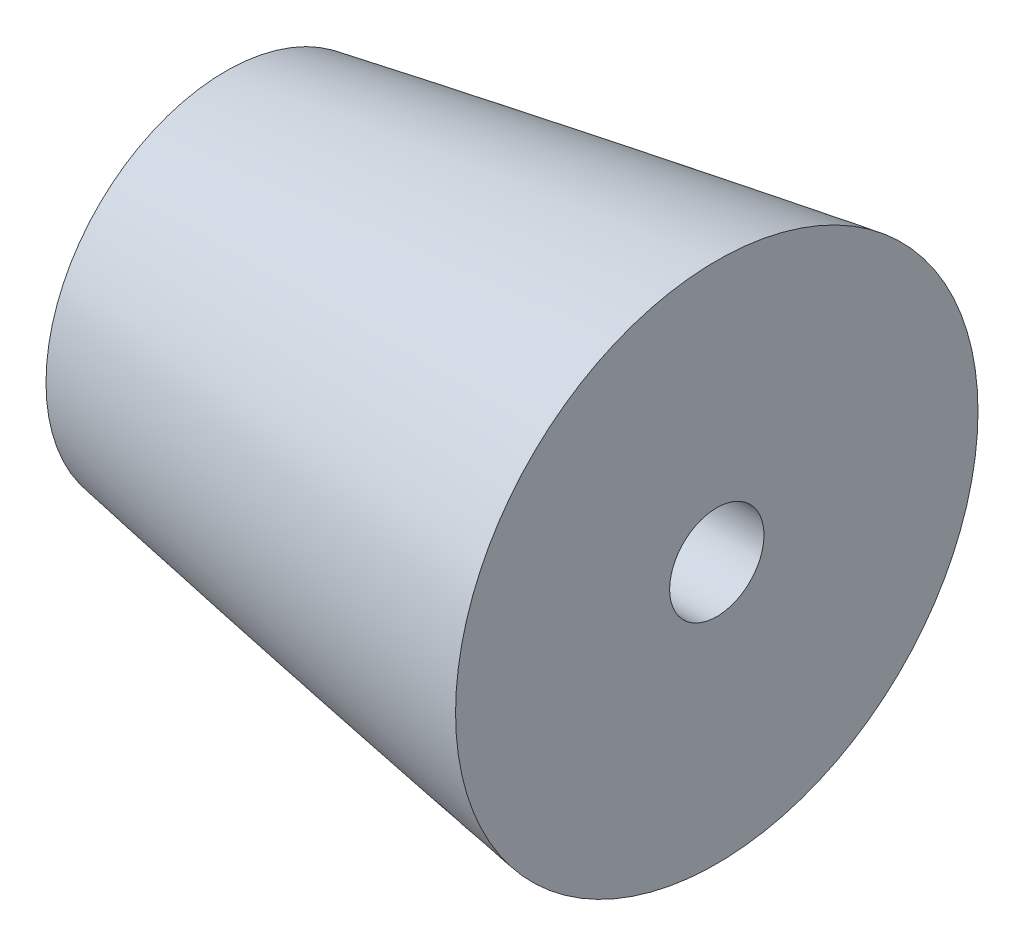
ISO-10303-21;
HEADER;
FILE_DESCRIPTION(('STEP AP214'),'2;1');
FILE_NAME('part.step','',(''),(''),'','','');
FILE_SCHEMA(('AUTOMOTIVE_DESIGN { 1 0 10303 214 1 1 1 1 }'));
ENDSEC;
DATA;
#1=APPLICATION_CONTEXT('core data for automotive mechanical design processes');
#2=APPLICATION_PROTOCOL_DEFINITION('international standard','automotive_design',2000,#1);
#3=PRODUCT_CONTEXT('',#1,'mechanical');
#4=PRODUCT('Part','Part','',(#3));
#5=PRODUCT_RELATED_PRODUCT_CATEGORY('part','',(#4));
#6=PRODUCT_DEFINITION_FORMATION('','',#4);
#7=PRODUCT_DEFINITION_CONTEXT('part definition',#1,'design');
#8=PRODUCT_DEFINITION('design','',#6,#7);
#9=PRODUCT_DEFINITION_SHAPE('','',#8);
#10=(LENGTH_UNIT() NAMED_UNIT(*) SI_UNIT(.MILLI.,.METRE.));
#11=(NAMED_UNIT(*) PLANE_ANGLE_UNIT() SI_UNIT($,.RADIAN.));
#12=(NAMED_UNIT(*) SI_UNIT($,.STERADIAN.) SOLID_ANGLE_UNIT());
#13=UNCERTAINTY_MEASURE_WITH_UNIT(LENGTH_MEASURE(1.E-05),#10,'distance_accuracy_value','');
#14=(GEOMETRIC_REPRESENTATION_CONTEXT(3) GLOBAL_UNCERTAINTY_ASSIGNED_CONTEXT((#13)) GLOBAL_UNIT_ASSIGNED_CONTEXT((#10,
#11,#12)) REPRESENTATION_CONTEXT('',''));
#15=CARTESIAN_POINT('',(0.,0.,0.));
#16=DIRECTION('',(0.,0.,1.));
#17=DIRECTION('',(1.,0.,0.));
#18=AXIS2_PLACEMENT_3D('',#15,#16,#17);
#19=CARTESIAN_POINT('',(95.7417361272295,17.3307506294971,0.));
#20=CARTESIAN_POINT('',(95.7026899948998,17.3246294006313,0.));
#21=CARTESIAN_POINT('',(95.6419233132433,17.315100540442,0.));
#22=CARTESIAN_POINT('',(95.3657275831846,17.2717719736624,0.));
#23=CARTESIAN_POINT('',(94.844966023065,17.1899461968987,0.));
#24=CARTESIAN_POINT('',(93.8770321432975,17.0375215251251,0.));
#25=CARTESIAN_POINT('',(92.7200919169159,16.8549107271648,0.));
#26=CARTESIAN_POINT('',(91.6938895777855,16.6922918799878,0.));
#27=CARTESIAN_POINT('',(90.7933738588896,16.5488661369637,0.));
#28=CARTESIAN_POINT('',(89.8430486763246,16.3971104254738,0.));
#29=CARTESIAN_POINT('',(88.8036622337914,16.2308690178494,0.));
#30=CARTESIAN_POINT('',(87.4335184384484,16.0109741956014,0.));
#31=CARTESIAN_POINT('',(85.8644555807975,15.7572764929284,0.));
#32=CARTESIAN_POINT('',(83.8214372349844,15.4255271724039,0.));
#33=CARTESIAN_POINT('',(81.8732068608084,15.1063877327224,0.));
#34=CARTESIAN_POINT('',(79.210210586862,14.6675124241253,0.));
#35=CARTESIAN_POINT('',(75.9256879766702,14.1199696501742,0.));
#36=CARTESIAN_POINT('',(72.611401479552,13.5590641195812,0.));
#37=CARTESIAN_POINT('',(70.3255414876523,13.1676842475676,0.));
#38=CARTESIAN_POINT('',(68.9786704427119,12.9354844364146,0.));
#39=CARTESIAN_POINT('',(68.0318680374417,12.7718040839555,0.));
#40=CARTESIAN_POINT('',(67.1552566093692,12.6193523462813,0.));
#41=CARTESIAN_POINT('',(66.5181415679137,12.5083477131257,0.));
#42=CARTESIAN_POINT('',(66.0618214211688,12.42870420297,0.));
#43=CARTESIAN_POINT('',(65.5510248778129,12.3392667115391,0.));
#44=CARTESIAN_POINT('',(64.9850290022117,12.2399064340898,0.));
#45=CARTESIAN_POINT('',(64.4640342660645,12.148295144802,0.));
#46=CARTESIAN_POINT('',(64.1955928803577,12.1010090199987,0.));
#47=CARTESIAN_POINT('',(64.0515193016492,12.0755961078034,0.));
#48=B_SPLINE_CURVE_WITH_KNOTS('',3,(#19,#20,#21,#22,#23,#24,#25,#26,#27,#28,#29,#30,#31,#32,#33,
#34,#35,#36,#37,#38,#39,#40,#41,#42,#43,#44,#45,#46,#47),.UNSPECIFIED.,.F.,.F.,(4,1,1,1,1,1,1,1,
1,1,1,1,1,1,1,1,1,1,1,1,1,1,1,1,1,1,4),(0.0827278377681683,0.086280733408362,0.0886493305018243,
0.108790394571926,0.134852951375684,0.160915508179442,0.186978064983199,0.213040621786957,
0.239103178590715,0.265165735394473,0.29122829219823,0.343353405805746,0.395478519413262,
0.447603633020777,0.499728746628293,0.603978973843324,0.708229201058355,0.76035431466587,
0.786416871469628,0.812479428273386,0.838541985077144,0.851573263479022,0.864604541880901,
0.87763582028278,0.890667098684659,0.903698377086538,0.916729655488417),.UNSPECIFIED.);
#49=CARTESIAN_POINT('',(70.2313270881002,0.528110105895485,0.));
#50=DIRECTION('',(-1.,0.,0.));
#51=AXIS1_PLACEMENT('',#49,#50);
#52=SURFACE_OF_REVOLUTION('',#48,#51);
#53=CARTESIAN_POINT('',(64.0515193016492,0.528110105895485,0.));
#54=DIRECTION('',(-1.,0.,0.));
#55=DIRECTION('',(0.,0.,1.));
#56=AXIS2_PLACEMENT_3D('',#53,#54,#55);
#57=CIRCLE('',#56,11.5474860019079);
#58=CARTESIAN_POINT('',(64.0515193016492,0.528110105895485,11.5474860019079));
#59=VERTEX_POINT('',#58);
#60=EDGE_CURVE('E10',#59,#59,#57,.T.);
#61=ORIENTED_EDGE('',*,*,#60,.F.);
#62=EDGE_LOOP('',(#61));
#63=FACE_BOUND('',#62,.T.);
#64=CARTESIAN_POINT('',(95.5916777215706,0.528110105895485,0.));
#65=DIRECTION('',(-1.,0.,0.));
#66=DIRECTION('',(0.,0.,1.));
#67=AXIS2_PLACEMENT_3D('',#64,#65,#66);
#68=CIRCLE('',#67,16.7791079279302);
#69=CARTESIAN_POINT('',(95.5916777215706,0.528110105895485,16.7791079279302));
#70=VERTEX_POINT('',#69);
#71=EDGE_CURVE('E71',#70,#70,#68,.T.);
#72=ORIENTED_EDGE('',*,*,#71,.T.);
#73=EDGE_LOOP('',(#72));
#74=FACE_BOUND('',#73,.T.);
#75=ADVANCED_FACE('F43',(#63,#74),#52,.T.);
#76=CARTESIAN_POINT('',(64.0515193016492,8.78311010589542,0.));
#77=DIRECTION('',(1.,0.,0.));
#78=DIRECTION('',(0.,0.,-1.));
#79=AXIS2_PLACEMENT_3D('',#76,#77,#78);
#80=PLANE('',#79);
#81=CARTESIAN_POINT('',(64.0515193016492,0.528110105895485,0.));
#82=DIRECTION('',(-1.,0.,0.));
#83=DIRECTION('',(0.,0.,1.));
#84=AXIS2_PLACEMENT_3D('',#81,#82,#83);
#85=CIRCLE('',#84,8.25499999999993);
#86=CARTESIAN_POINT('',(64.0515193016492,0.528110105895485,8.25499999999993));
#87=VERTEX_POINT('',#86);
#88=EDGE_CURVE('E51',#87,#87,#85,.T.);
#89=ORIENTED_EDGE('',*,*,#88,.F.);
#90=EDGE_LOOP('',(#89));
#91=FACE_BOUND('',#90,.T.);
#92=ORIENTED_EDGE('',*,*,#60,.T.);
#93=EDGE_LOOP('',(#92));
#94=FACE_BOUND('',#93,.T.);
#95=ADVANCED_FACE('F103',(#91,#94),#80,.F.);
#96=CARTESIAN_POINT('',(70.2313270881002,0.528110105895485,0.));
#97=DIRECTION('',(-1.,0.,0.));
#98=DIRECTION('',(0.,0.,1.));
#99=AXIS2_PLACEMENT_3D('',#96,#97,#98);
#100=CYLINDRICAL_SURFACE('',#99,8.25499999999993);
#101=CARTESIAN_POINT('',(70.2313270881002,0.528110105895485,0.));
#102=DIRECTION('',(-1.,0.,0.));
#103=DIRECTION('',(0.,0.,1.));
#104=AXIS2_PLACEMENT_3D('',#101,#102,#103);
#105=CIRCLE('',#104,8.25499999999994);
#106=CARTESIAN_POINT('',(70.2313270881002,0.528110105895485,8.25499999999994));
#107=VERTEX_POINT('',#106);
#108=EDGE_CURVE('E56',#107,#107,#105,.T.);
#109=ORIENTED_EDGE('',*,*,#108,.F.);
#110=EDGE_LOOP('',(#109));
#111=FACE_BOUND('',#110,.T.);
#112=ORIENTED_EDGE('',*,*,#88,.T.);
#113=EDGE_LOOP('',(#112));
#114=FACE_BOUND('',#113,.T.);
#115=ADVANCED_FACE('F98',(#111,#114),#100,.F.);
#116=CARTESIAN_POINT('',(70.2313270881002,3.55815558890862,0.));
#117=DIRECTION('',(1.,0.,0.));
#118=DIRECTION('',(0.,0.,-1.));
#119=AXIS2_PLACEMENT_3D('',#116,#117,#118);
#120=PLANE('',#119);
#121=CARTESIAN_POINT('',(70.2313270881002,0.528110105895485,0.));
#122=DIRECTION('',(-1.,0.,0.));
#123=DIRECTION('',(0.,0.,1.));
#124=AXIS2_PLACEMENT_3D('',#121,#122,#123);
#125=CIRCLE('',#124,3.03004548301313);
#126=CARTESIAN_POINT('',(70.2313270881002,0.528110105895485,3.03004548301313));
#127=VERTEX_POINT('',#126);
#128=EDGE_CURVE('E61',#127,#127,#125,.T.);
#129=ORIENTED_EDGE('',*,*,#128,.F.);
#130=EDGE_LOOP('',(#129));
#131=FACE_BOUND('',#130,.T.);
#132=ORIENTED_EDGE('',*,*,#108,.T.);
#133=EDGE_LOOP('',(#132));
#134=FACE_BOUND('',#133,.T.);
#135=ADVANCED_FACE('F92',(#131,#134),#120,.F.);
#136=CARTESIAN_POINT('',(70.2313270881002,0.528110105895485,0.));
#137=DIRECTION('',(-1.,0.,0.));
#138=DIRECTION('',(0.,0.,1.));
#139=AXIS2_PLACEMENT_3D('',#136,#137,#138);
#140=CYLINDRICAL_SURFACE('',#139,3.03004548301313);
#141=CARTESIAN_POINT('',(95.5916777215706,0.528110105895485,0.));
#142=DIRECTION('',(-1.,0.,0.));
#143=DIRECTION('',(0.,0.,1.));
#144=AXIS2_PLACEMENT_3D('',#141,#142,#143);
#145=CIRCLE('',#144,3.03004548301313);
#146=CARTESIAN_POINT('',(95.5916777215706,0.528110105895485,3.03004548301313));
#147=VERTEX_POINT('',#146);
#148=EDGE_CURVE('E67',#147,#147,#145,.T.);
#149=ORIENTED_EDGE('',*,*,#148,.F.);
#150=EDGE_LOOP('',(#149));
#151=FACE_BOUND('',#150,.T.);
#152=ORIENTED_EDGE('',*,*,#128,.T.);
#153=EDGE_LOOP('',(#152));
#154=FACE_BOUND('',#153,.T.);
#155=ADVANCED_FACE('F86',(#151,#154),#140,.F.);
#156=CARTESIAN_POINT('',(95.5916777215706,3.55815558890862,0.));
#157=DIRECTION('',(-1.,0.,0.));
#158=DIRECTION('',(0.,0.,1.));
#159=AXIS2_PLACEMENT_3D('',#156,#157,#158);
#160=PLANE('',#159);
#161=ORIENTED_EDGE('',*,*,#71,.F.);
#162=EDGE_LOOP('',(#161));
#163=FACE_BOUND('',#162,.T.);
#164=ORIENTED_EDGE('',*,*,#148,.T.);
#165=EDGE_LOOP('',(#164));
#166=FACE_BOUND('',#165,.T.);
#167=ADVANCED_FACE('F83',(#163,#166),#160,.F.);
#168=CLOSED_SHELL('',(#75,#95,#115,#135,#155,#167));
#169=MANIFOLD_SOLID_BREP('B2',#168);
#170=ADVANCED_BREP_SHAPE_REPRESENTATION('',(#18,#169),#14);
#171=SHAPE_DEFINITION_REPRESENTATION(#9,#170);
ENDSEC;
END-ISO-10303-21;
